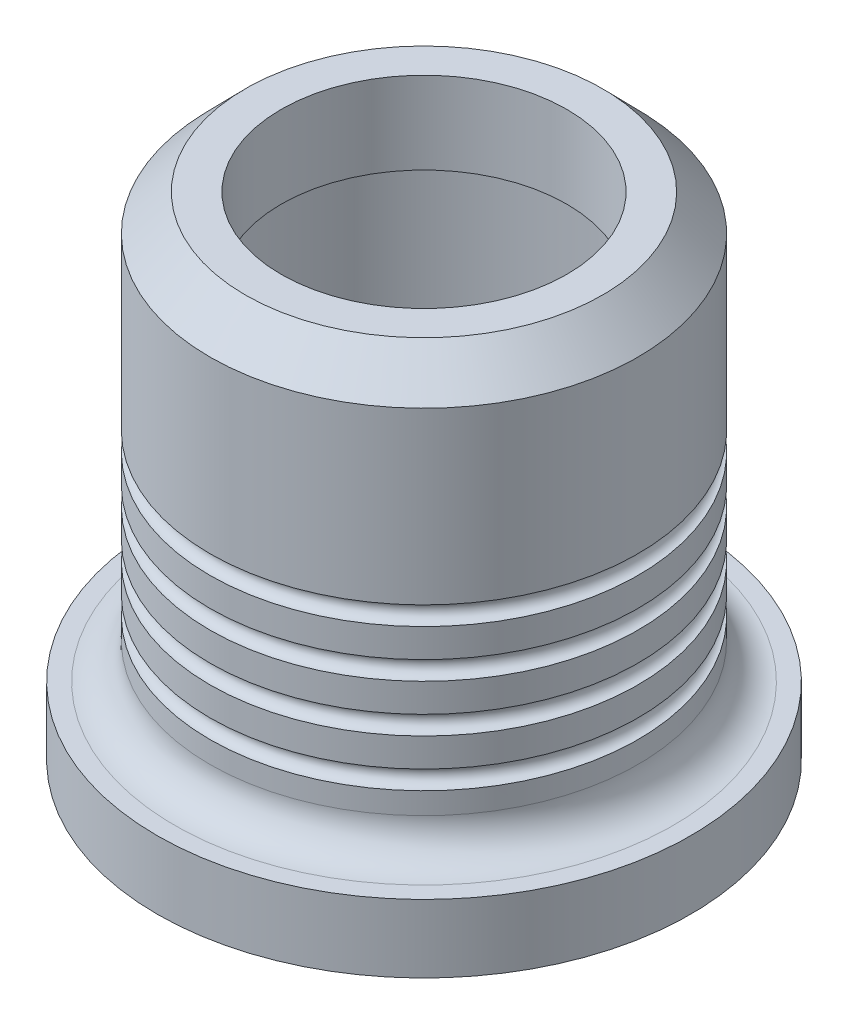
ISO-10303-21;
HEADER;
FILE_DESCRIPTION(('STEP AP214'),'2;1');
FILE_NAME('part.step','',(''),(''),'','','');
FILE_SCHEMA(('AUTOMOTIVE_DESIGN { 1 0 10303 214 1 1 1 1 }'));
ENDSEC;
DATA;
#1=APPLICATION_CONTEXT('core data for automotive mechanical design processes');
#2=APPLICATION_PROTOCOL_DEFINITION('international standard','automotive_design',2000,#1);
#3=PRODUCT_CONTEXT('',#1,'mechanical');
#4=PRODUCT('Part','Part','',(#3));
#5=PRODUCT_RELATED_PRODUCT_CATEGORY('part','',(#4));
#6=PRODUCT_DEFINITION_FORMATION('','',#4);
#7=PRODUCT_DEFINITION_CONTEXT('part definition',#1,'design');
#8=PRODUCT_DEFINITION('design','',#6,#7);
#9=PRODUCT_DEFINITION_SHAPE('','',#8);
#10=(LENGTH_UNIT() NAMED_UNIT(*) SI_UNIT(.MILLI.,.METRE.));
#11=(NAMED_UNIT(*) PLANE_ANGLE_UNIT() SI_UNIT($,.RADIAN.));
#12=(NAMED_UNIT(*) SI_UNIT($,.STERADIAN.) SOLID_ANGLE_UNIT());
#13=UNCERTAINTY_MEASURE_WITH_UNIT(LENGTH_MEASURE(1.E-05),#10,'distance_accuracy_value','');
#14=(GEOMETRIC_REPRESENTATION_CONTEXT(3) GLOBAL_UNCERTAINTY_ASSIGNED_CONTEXT((#13)) GLOBAL_UNIT_ASSIGNED_CONTEXT((#10,
#11,#12)) REPRESENTATION_CONTEXT('',''));
#15=CARTESIAN_POINT('',(0.,0.,0.));
#16=DIRECTION('',(0.,0.,1.));
#17=DIRECTION('',(1.,0.,0.));
#18=AXIS2_PLACEMENT_3D('',#15,#16,#17);
#19=CARTESIAN_POINT('',(0.,13.893098484403,0.));
#20=DIRECTION('',(0.,-1.,0.));
#21=DIRECTION('',(0.,0.,-1.));
#22=AXIS2_PLACEMENT_3D('',#19,#20,#21);
#23=CONICAL_SURFACE('',#22,9.12245232802987,0.775157037864906);
#24=CARTESIAN_POINT('',(0.,15.4308660082243,0.));
#25=DIRECTION('',(0.,1.,0.));
#26=DIRECTION('',(0.,0.,1.));
#27=AXIS2_PLACEMENT_3D('',#24,#25,#26);
#28=CIRCLE('',#27,7.61586352949421);
#29=CARTESIAN_POINT('',(0.,15.4308660082243,7.61586352949421));
#30=VERTEX_POINT('',#29);
#31=EDGE_CURVE('E46',#30,#30,#28,.T.);
#32=ORIENTED_EDGE('',*,*,#31,.F.);
#33=EDGE_LOOP('',(#32));
#34=FACE_BOUND('',#33,.T.);
#35=CARTESIAN_POINT('',(0.,13.893098484403,0.));
#36=DIRECTION('',(0.,1.,0.));
#37=DIRECTION('',(0.,0.,1.));
#38=AXIS2_PLACEMENT_3D('',#35,#36,#37);
#39=CIRCLE('',#38,9.12245232802987);
#40=CARTESIAN_POINT('',(0.,13.893098484403,9.12245232802987));
#41=VERTEX_POINT('',#40);
#42=EDGE_CURVE('E100',#41,#41,#39,.T.);
#43=ORIENTED_EDGE('',*,*,#42,.T.);
#44=EDGE_LOOP('',(#43));
#45=FACE_BOUND('',#44,.T.);
#46=ADVANCED_FACE('F35',(#34,#45),#23,.T.);
#47=CARTESIAN_POINT('',(6.09180829027308,15.4308660082243,0.));
#48=DIRECTION('',(0.,-1.,0.));
#49=DIRECTION('',(0.,0.,-1.));
#50=AXIS2_PLACEMENT_3D('',#47,#48,#49);
#51=PLANE('',#50);
#52=CARTESIAN_POINT('',(0.,15.4308660082243,0.));
#53=DIRECTION('',(0.,1.,0.));
#54=DIRECTION('',(0.,0.,1.));
#55=AXIS2_PLACEMENT_3D('',#52,#53,#54);
#56=CIRCLE('',#55,6.09180829027308);
#57=CARTESIAN_POINT('',(0.,15.4308660082243,6.09180829027308));
#58=VERTEX_POINT('',#57);
#59=EDGE_CURVE('E50',#58,#58,#56,.T.);
#60=ORIENTED_EDGE('',*,*,#59,.F.);
#61=EDGE_LOOP('',(#60));
#62=FACE_BOUND('',#61,.T.);
#63=ORIENTED_EDGE('',*,*,#31,.T.);
#64=EDGE_LOOP('',(#63));
#65=FACE_BOUND('',#64,.T.);
#66=ADVANCED_FACE('F163',(#62,#65),#51,.F.);
#67=CARTESIAN_POINT('',(0.,28.0850757367892,0.));
#68=DIRECTION('',(0.,1.,0.));
#69=DIRECTION('',(0.,0.,1.));
#70=AXIS2_PLACEMENT_3D('',#67,#68,#69);
#71=CYLINDRICAL_SURFACE('',#70,6.09180829027308);
#72=CARTESIAN_POINT('',(0.,11.9308660082243,0.));
#73=DIRECTION('',(0.,1.,0.));
#74=DIRECTION('',(0.,0.,1.));
#75=AXIS2_PLACEMENT_3D('',#72,#73,#74);
#76=CIRCLE('',#75,6.09180829027308);
#77=CARTESIAN_POINT('',(0.,11.9308660082243,6.09180829027308));
#78=VERTEX_POINT('',#77);
#79=EDGE_CURVE('E55',#78,#78,#76,.T.);
#80=ORIENTED_EDGE('',*,*,#79,.F.);
#81=EDGE_LOOP('',(#80));
#82=FACE_BOUND('',#81,.T.);
#83=ORIENTED_EDGE('',*,*,#59,.T.);
#84=EDGE_LOOP('',(#83));
#85=FACE_BOUND('',#84,.T.);
#86=ADVANCED_FACE('F168',(#82,#85),#71,.F.);
#87=CARTESIAN_POINT('',(8.07499997357273,11.9308660082243,0.));
#88=DIRECTION('',(0.,1.,0.));
#89=DIRECTION('',(0.,0.,1.));
#90=AXIS2_PLACEMENT_3D('',#87,#88,#89);
#91=PLANE('',#90);
#92=CARTESIAN_POINT('',(0.,11.9308660082243,0.));
#93=DIRECTION('',(0.,1.,0.));
#94=DIRECTION('',(0.,0.,1.));
#95=AXIS2_PLACEMENT_3D('',#92,#93,#94);
#96=CIRCLE('',#95,8.07499997357273);
#97=CARTESIAN_POINT('',(0.,11.9308660082243,8.07499997357273));
#98=VERTEX_POINT('',#97);
#99=EDGE_CURVE('E58',#98,#98,#96,.T.);
#100=ORIENTED_EDGE('',*,*,#99,.F.);
#101=EDGE_LOOP('',(#100));
#102=FACE_BOUND('',#101,.T.);
#103=ORIENTED_EDGE('',*,*,#79,.T.);
#104=EDGE_LOOP('',(#103));
#105=FACE_BOUND('',#104,.T.);
#106=ADVANCED_FACE('F175',(#102,#105),#91,.F.);
#107=CARTESIAN_POINT('',(0.,28.0850757367892,0.));
#108=DIRECTION('',(0.,1.,0.));
#109=DIRECTION('',(0.,0.,1.));
#110=AXIS2_PLACEMENT_3D('',#107,#108,#109);
#111=CYLINDRICAL_SURFACE('',#110,8.07499997357273);
#112=CARTESIAN_POINT('',(0.,-3.04697245447551,0.));
#113=DIRECTION('',(0.,1.,0.));
#114=DIRECTION('',(0.,0.,1.));
#115=AXIS2_PLACEMENT_3D('',#112,#113,#114);
#116=CIRCLE('',#115,8.07499997357273);
#117=CARTESIAN_POINT('',(0.,-3.04697245447551,8.07499997357273));
#118=VERTEX_POINT('',#117);
#119=EDGE_CURVE('E61',#118,#118,#116,.T.);
#120=ORIENTED_EDGE('',*,*,#119,.F.);
#121=EDGE_LOOP('',(#120));
#122=FACE_BOUND('',#121,.T.);
#123=ORIENTED_EDGE('',*,*,#99,.T.);
#124=EDGE_LOOP('',(#123));
#125=FACE_BOUND('',#124,.T.);
#126=ADVANCED_FACE('F179',(#122,#125),#111,.F.);
#127=CARTESIAN_POINT('',(0.,-3.79697247078495,0.));
#128=DIRECTION('',(0.,1.,0.));
#129=DIRECTION('',(0.,0.,1.));
#130=AXIS2_PLACEMENT_3D('',#127,#128,#129);
#131=TOROIDAL_SURFACE('',#130,7.14928308950068,1.19140747602164);
#132=CARTESIAN_POINT('',(0.,-4.54697245447551,0.));
#133=DIRECTION('',(0.,1.,0.));
#134=DIRECTION('',(0.,0.,1.));
#135=AXIS2_PLACEMENT_3D('',#132,#133,#134);
#136=CIRCLE('',#135,8.075);
#137=CARTESIAN_POINT('',(0.,-4.54697245447551,8.075));
#138=VERTEX_POINT('',#137);
#139=EDGE_CURVE('E64',#138,#138,#136,.T.);
#140=ORIENTED_EDGE('',*,*,#139,.F.);
#141=EDGE_LOOP('',(#140));
#142=FACE_BOUND('',#141,.T.);
#143=ORIENTED_EDGE('',*,*,#119,.T.);
#144=EDGE_LOOP('',(#143));
#145=FACE_BOUND('',#144,.T.);
#146=ADVANCED_FACE('F183',(#142,#145),#131,.F.);
#147=CARTESIAN_POINT('',(0.,28.0850757367892,0.));
#148=DIRECTION('',(0.,1.,0.));
#149=DIRECTION('',(0.,0.,1.));
#150=AXIS2_PLACEMENT_3D('',#147,#148,#149);
#151=CYLINDRICAL_SURFACE('',#150,8.075);
#152=CARTESIAN_POINT('',(0.,-5.54697245447551,0.));
#153=DIRECTION('',(0.,1.,0.));
#154=DIRECTION('',(0.,0.,1.));
#155=AXIS2_PLACEMENT_3D('',#152,#153,#154);
#156=CIRCLE('',#155,8.075);
#157=CARTESIAN_POINT('',(0.,-5.54697245447551,8.075));
#158=VERTEX_POINT('',#157);
#159=EDGE_CURVE('E67',#158,#158,#156,.T.);
#160=ORIENTED_EDGE('',*,*,#159,.F.);
#161=EDGE_LOOP('',(#160));
#162=FACE_BOUND('',#161,.T.);
#163=ORIENTED_EDGE('',*,*,#139,.T.);
#164=EDGE_LOOP('',(#163));
#165=FACE_BOUND('',#164,.T.);
#166=ADVANCED_FACE('F187',(#162,#165),#151,.F.);
#167=CARTESIAN_POINT('',(8.075,-5.54697245447551,0.));
#168=DIRECTION('',(0.,1.,0.));
#169=DIRECTION('',(0.,0.,1.));
#170=AXIS2_PLACEMENT_3D('',#167,#168,#169);
#171=PLANE('',#170);
#172=CARTESIAN_POINT('',(0.,-5.54697245447551,0.));
#173=DIRECTION('',(0.,1.,0.));
#174=DIRECTION('',(0.,0.,1.));
#175=AXIS2_PLACEMENT_3D('',#172,#173,#174);
#176=CIRCLE('',#175,11.375);
#177=CARTESIAN_POINT('',(0.,-5.54697245447551,11.375));
#178=VERTEX_POINT('',#177);
#179=EDGE_CURVE('E70',#178,#178,#176,.T.);
#180=ORIENTED_EDGE('',*,*,#179,.F.);
#181=EDGE_LOOP('',(#180));
#182=FACE_BOUND('',#181,.T.);
#183=ORIENTED_EDGE('',*,*,#159,.T.);
#184=EDGE_LOOP('',(#183));
#185=FACE_BOUND('',#184,.T.);
#186=ADVANCED_FACE('F191',(#182,#185),#171,.F.);
#187=CARTESIAN_POINT('',(0.,28.0850757367892,0.));
#188=DIRECTION('',(0.,1.,0.));
#189=DIRECTION('',(0.,0.,1.));
#190=AXIS2_PLACEMENT_3D('',#187,#188,#189);
#191=CYLINDRICAL_SURFACE('',#190,11.375);
#192=CARTESIAN_POINT('',(0.,-2.64697245447551,0.));
#193=DIRECTION('',(0.,1.,0.));
#194=DIRECTION('',(0.,0.,1.));
#195=AXIS2_PLACEMENT_3D('',#192,#193,#194);
#196=CIRCLE('',#195,11.375);
#197=CARTESIAN_POINT('',(0.,-2.64697245447551,11.375));
#198=VERTEX_POINT('',#197);
#199=EDGE_CURVE('E73',#198,#198,#196,.T.);
#200=ORIENTED_EDGE('',*,*,#199,.F.);
#201=EDGE_LOOP('',(#200));
#202=FACE_BOUND('',#201,.T.);
#203=ORIENTED_EDGE('',*,*,#179,.T.);
#204=EDGE_LOOP('',(#203));
#205=FACE_BOUND('',#204,.T.);
#206=ADVANCED_FACE('F160',(#202,#205),#191,.T.);
#207=CARTESIAN_POINT('',(9.12245232802987,-2.64697245447551,0.));
#208=DIRECTION('',(0.,-1.,0.));
#209=DIRECTION('',(0.,0.,-1.));
#210=AXIS2_PLACEMENT_3D('',#207,#208,#209);
#211=PLANE('',#210);
#212=CARTESIAN_POINT('',(0.,-2.64697245447551,0.));
#213=DIRECTION('',(0.,-1.,0.));
#214=DIRECTION('',(0.,0.,-1.));
#215=AXIS2_PLACEMENT_3D('',#212,#213,#214);
#216=CIRCLE('',#215,10.6224523280299);
#217=CARTESIAN_POINT('',(0.,-2.64697245447551,-10.6224523280299));
#218=VERTEX_POINT('',#217);
#219=EDGE_CURVE('E10',#218,#218,#216,.T.);
#220=ORIENTED_EDGE('',*,*,#219,.T.);
#221=EDGE_LOOP('',(#220));
#222=FACE_BOUND('',#221,.T.);
#223=ORIENTED_EDGE('',*,*,#199,.T.);
#224=EDGE_LOOP('',(#223));
#225=FACE_BOUND('',#224,.T.);
#226=ADVANCED_FACE('F155',(#222,#225),#211,.F.);
#227=CARTESIAN_POINT('',(0.,28.0850757367892,0.));
#228=DIRECTION('',(0.,1.,0.));
#229=DIRECTION('',(0.,0.,1.));
#230=AXIS2_PLACEMENT_3D('',#227,#228,#229);
#231=CYLINDRICAL_SURFACE('',#230,9.12245232802987);
#232=CARTESIAN_POINT('',(0.,-1.14697245447551,0.));
#233=DIRECTION('',(0.,-1.,0.));
#234=DIRECTION('',(0.,0.,-1.));
#235=AXIS2_PLACEMENT_3D('',#232,#233,#234);
#236=CIRCLE('',#235,9.12245232802987);
#237=CARTESIAN_POINT('',(0.,-1.14697245447551,-9.12245232802987));
#238=VERTEX_POINT('',#237);
#239=EDGE_CURVE('E42',#238,#238,#236,.F.);
#240=ORIENTED_EDGE('',*,*,#239,.T.);
#241=EDGE_LOOP('',(#240));
#242=FACE_BOUND('',#241,.T.);
#243=CARTESIAN_POINT('',(0.,-0.226972454475508,0.));
#244=DIRECTION('',(0.,1.,0.));
#245=DIRECTION('',(0.,0.,1.));
#246=AXIS2_PLACEMENT_3D('',#243,#244,#245);
#247=CIRCLE('',#246,9.12245232802987);
#248=CARTESIAN_POINT('',(0.,-0.226972454475508,9.12245232802987));
#249=VERTEX_POINT('',#248);
#250=EDGE_CURVE('E76',#249,#249,#247,.T.);
#251=ORIENTED_EDGE('',*,*,#250,.F.);
#252=EDGE_LOOP('',(#251));
#253=FACE_BOUND('',#252,.T.);
#254=ADVANCED_FACE('F150',(#242,#253),#231,.T.);
#255=CARTESIAN_POINT('',(0.,0.173027545524491,0.));
#256=DIRECTION('',(0.,1.,0.));
#257=DIRECTION('',(0.,0.,1.));
#258=AXIS2_PLACEMENT_3D('',#255,#256,#257);
#259=TOROIDAL_SURFACE('',#258,9.12245232802987,0.4);
#260=CARTESIAN_POINT('',(0.,0.57302754552449,0.));
#261=DIRECTION('',(0.,1.,0.));
#262=DIRECTION('',(0.,0.,1.));
#263=AXIS2_PLACEMENT_3D('',#260,#261,#262);
#264=CIRCLE('',#263,9.12245232802987);
#265=CARTESIAN_POINT('',(0.,0.57302754552449,9.12245232802987));
#266=VERTEX_POINT('',#265);
#267=EDGE_CURVE('E79',#266,#266,#264,.T.);
#268=ORIENTED_EDGE('',*,*,#267,.F.);
#269=EDGE_LOOP('',(#268));
#270=FACE_BOUND('',#269,.T.);
#271=ORIENTED_EDGE('',*,*,#250,.T.);
#272=EDGE_LOOP('',(#271));
#273=FACE_BOUND('',#272,.T.);
#274=ADVANCED_FACE('F144',(#270,#273),#259,.F.);
#275=CARTESIAN_POINT('',(0.,28.0850757367892,0.));
#276=DIRECTION('',(0.,1.,0.));
#277=DIRECTION('',(0.,0.,1.));
#278=AXIS2_PLACEMENT_3D('',#275,#276,#277);
#279=CYLINDRICAL_SURFACE('',#278,9.12245232802987);
#280=CARTESIAN_POINT('',(0.,1.79302754552449,0.));
#281=DIRECTION('',(0.,1.,0.));
#282=DIRECTION('',(0.,0.,1.));
#283=AXIS2_PLACEMENT_3D('',#280,#281,#282);
#284=CIRCLE('',#283,9.12245232802987);
#285=CARTESIAN_POINT('',(0.,1.79302754552449,9.12245232802987));
#286=VERTEX_POINT('',#285);
#287=EDGE_CURVE('E82',#286,#286,#284,.T.);
#288=ORIENTED_EDGE('',*,*,#287,.F.);
#289=EDGE_LOOP('',(#288));
#290=FACE_BOUND('',#289,.T.);
#291=ORIENTED_EDGE('',*,*,#267,.T.);
#292=EDGE_LOOP('',(#291));
#293=FACE_BOUND('',#292,.T.);
#294=ADVANCED_FACE('F138',(#290,#293),#279,.T.);
#295=CARTESIAN_POINT('',(0.,2.19302754552449,0.));
#296=DIRECTION('',(0.,1.,0.));
#297=DIRECTION('',(0.,0.,1.));
#298=AXIS2_PLACEMENT_3D('',#295,#296,#297);
#299=TOROIDAL_SURFACE('',#298,9.12245232802987,0.4);
#300=CARTESIAN_POINT('',(0.,2.59302754552449,0.));
#301=DIRECTION('',(0.,1.,0.));
#302=DIRECTION('',(0.,0.,1.));
#303=AXIS2_PLACEMENT_3D('',#300,#301,#302);
#304=CIRCLE('',#303,9.12245232802987);
#305=CARTESIAN_POINT('',(0.,2.59302754552449,9.12245232802987));
#306=VERTEX_POINT('',#305);
#307=EDGE_CURVE('E85',#306,#306,#304,.T.);
#308=ORIENTED_EDGE('',*,*,#307,.F.);
#309=EDGE_LOOP('',(#308));
#310=FACE_BOUND('',#309,.T.);
#311=ORIENTED_EDGE('',*,*,#287,.T.);
#312=EDGE_LOOP('',(#311));
#313=FACE_BOUND('',#312,.T.);
#314=ADVANCED_FACE('F132',(#310,#313),#299,.F.);
#315=CARTESIAN_POINT('',(0.,28.0850757367892,0.));
#316=DIRECTION('',(0.,1.,0.));
#317=DIRECTION('',(0.,0.,1.));
#318=AXIS2_PLACEMENT_3D('',#315,#316,#317);
#319=CYLINDRICAL_SURFACE('',#318,9.12245232802987);
#320=CARTESIAN_POINT('',(0.,3.81302754552449,0.));
#321=DIRECTION('',(0.,1.,0.));
#322=DIRECTION('',(0.,0.,1.));
#323=AXIS2_PLACEMENT_3D('',#320,#321,#322);
#324=CIRCLE('',#323,9.12245232802987);
#325=CARTESIAN_POINT('',(0.,3.81302754552449,9.12245232802987));
#326=VERTEX_POINT('',#325);
#327=EDGE_CURVE('E88',#326,#326,#324,.T.);
#328=ORIENTED_EDGE('',*,*,#327,.F.);
#329=EDGE_LOOP('',(#328));
#330=FACE_BOUND('',#329,.T.);
#331=ORIENTED_EDGE('',*,*,#307,.T.);
#332=EDGE_LOOP('',(#331));
#333=FACE_BOUND('',#332,.T.);
#334=ADVANCED_FACE('F126',(#330,#333),#319,.T.);
#335=CARTESIAN_POINT('',(0.,4.21302754552449,0.));
#336=DIRECTION('',(0.,1.,0.));
#337=DIRECTION('',(0.,0.,1.));
#338=AXIS2_PLACEMENT_3D('',#335,#336,#337);
#339=TOROIDAL_SURFACE('',#338,9.12245232802987,0.4);
#340=CARTESIAN_POINT('',(0.,4.61302754552449,0.));
#341=DIRECTION('',(0.,1.,0.));
#342=DIRECTION('',(0.,0.,1.));
#343=AXIS2_PLACEMENT_3D('',#340,#341,#342);
#344=CIRCLE('',#343,9.12245232802987);
#345=CARTESIAN_POINT('',(0.,4.61302754552449,9.12245232802987));
#346=VERTEX_POINT('',#345);
#347=EDGE_CURVE('E91',#346,#346,#344,.T.);
#348=ORIENTED_EDGE('',*,*,#347,.F.);
#349=EDGE_LOOP('',(#348));
#350=FACE_BOUND('',#349,.T.);
#351=ORIENTED_EDGE('',*,*,#327,.T.);
#352=EDGE_LOOP('',(#351));
#353=FACE_BOUND('',#352,.T.);
#354=ADVANCED_FACE('F120',(#350,#353),#339,.F.);
#355=CARTESIAN_POINT('',(0.,28.0850757367892,0.));
#356=DIRECTION('',(0.,1.,0.));
#357=DIRECTION('',(0.,0.,1.));
#358=AXIS2_PLACEMENT_3D('',#355,#356,#357);
#359=CYLINDRICAL_SURFACE('',#358,9.12245232802987);
#360=CARTESIAN_POINT('',(0.,5.83302754552449,0.));
#361=DIRECTION('',(0.,1.,0.));
#362=DIRECTION('',(0.,0.,1.));
#363=AXIS2_PLACEMENT_3D('',#360,#361,#362);
#364=CIRCLE('',#363,9.12245232802987);
#365=CARTESIAN_POINT('',(0.,5.83302754552449,9.12245232802987));
#366=VERTEX_POINT('',#365);
#367=EDGE_CURVE('E94',#366,#366,#364,.T.);
#368=ORIENTED_EDGE('',*,*,#367,.F.);
#369=EDGE_LOOP('',(#368));
#370=FACE_BOUND('',#369,.T.);
#371=ORIENTED_EDGE('',*,*,#347,.T.);
#372=EDGE_LOOP('',(#371));
#373=FACE_BOUND('',#372,.T.);
#374=ADVANCED_FACE('F114',(#370,#373),#359,.T.);
#375=CARTESIAN_POINT('',(0.,6.23302754552449,0.));
#376=DIRECTION('',(0.,1.,0.));
#377=DIRECTION('',(0.,0.,1.));
#378=AXIS2_PLACEMENT_3D('',#375,#376,#377);
#379=TOROIDAL_SURFACE('',#378,9.12245232802987,0.4);
#380=CARTESIAN_POINT('',(0.,6.63302754552449,0.));
#381=DIRECTION('',(0.,1.,0.));
#382=DIRECTION('',(0.,0.,1.));
#383=AXIS2_PLACEMENT_3D('',#380,#381,#382);
#384=CIRCLE('',#383,9.12245232802987);
#385=CARTESIAN_POINT('',(0.,6.63302754552449,9.12245232802987));
#386=VERTEX_POINT('',#385);
#387=EDGE_CURVE('E97',#386,#386,#384,.T.);
#388=ORIENTED_EDGE('',*,*,#387,.F.);
#389=EDGE_LOOP('',(#388));
#390=FACE_BOUND('',#389,.T.);
#391=ORIENTED_EDGE('',*,*,#367,.T.);
#392=EDGE_LOOP('',(#391));
#393=FACE_BOUND('',#392,.T.);
#394=ADVANCED_FACE('F108',(#390,#393),#379,.F.);
#395=CARTESIAN_POINT('',(0.,28.0850757367892,0.));
#396=DIRECTION('',(0.,1.,0.));
#397=DIRECTION('',(0.,0.,1.));
#398=AXIS2_PLACEMENT_3D('',#395,#396,#397);
#399=CYLINDRICAL_SURFACE('',#398,9.12245232802987);
#400=ORIENTED_EDGE('',*,*,#42,.F.);
#401=EDGE_LOOP('',(#400));
#402=FACE_BOUND('',#401,.T.);
#403=ORIENTED_EDGE('',*,*,#387,.T.);
#404=EDGE_LOOP('',(#403));
#405=FACE_BOUND('',#404,.T.);
#406=ADVANCED_FACE('F105',(#402,#405),#399,.T.);
#407=CARTESIAN_POINT('',(0.,-1.14697245447551,0.));
#408=DIRECTION('',(0.,-1.,0.));
#409=DIRECTION('',(0.,0.,-1.));
#410=AXIS2_PLACEMENT_3D('',#407,#408,#409);
#411=TOROIDAL_SURFACE('',#410,10.6224523280299,1.5);
#412=ORIENTED_EDGE('',*,*,#219,.F.);
#413=EDGE_LOOP('',(#412));
#414=FACE_BOUND('',#413,.T.);
#415=ORIENTED_EDGE('',*,*,#239,.F.);
#416=EDGE_LOOP('',(#415));
#417=FACE_BOUND('',#416,.T.);
#418=ADVANCED_FACE('F37',(#414,#417),#411,.F.);
#419=CLOSED_SHELL('',(#46,#66,#86,#106,#126,#146,#166,#186,#206,#226,#254,#274,#294,#314,#334,
#354,#374,#394,#406,#418));
#420=MANIFOLD_SOLID_BREP('B2',#419);
#421=ADVANCED_BREP_SHAPE_REPRESENTATION('',(#18,#420),#14);
#422=SHAPE_DEFINITION_REPRESENTATION(#9,#421);
ENDSEC;
END-ISO-10303-21;
